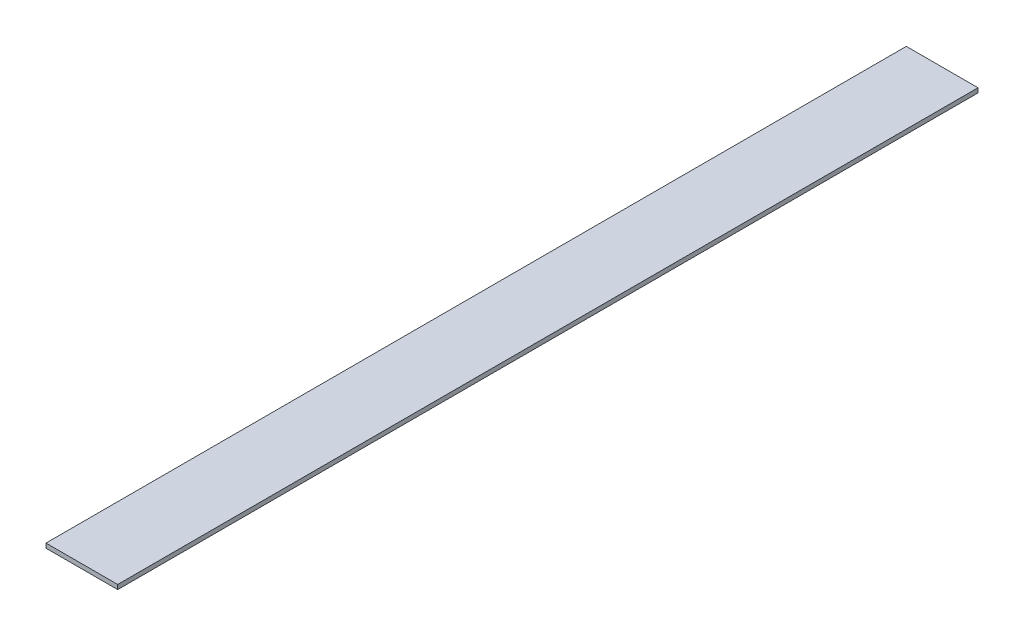
ISO-10303-21;
HEADER;
FILE_DESCRIPTION(('STEP AP214'),'2;1');
FILE_NAME('part.step','',(''),(''),'','','');
FILE_SCHEMA(('AUTOMOTIVE_DESIGN { 1 0 10303 214 1 1 1 1 }'));
ENDSEC;
DATA;
#1=APPLICATION_CONTEXT('core data for automotive mechanical design processes');
#2=APPLICATION_PROTOCOL_DEFINITION('international standard','automotive_design',2000,#1);
#3=PRODUCT_CONTEXT('',#1,'mechanical');
#4=PRODUCT('Part','Part','',(#3));
#5=PRODUCT_RELATED_PRODUCT_CATEGORY('part','',(#4));
#6=PRODUCT_DEFINITION_FORMATION('','',#4);
#7=PRODUCT_DEFINITION_CONTEXT('part definition',#1,'design');
#8=PRODUCT_DEFINITION('design','',#6,#7);
#9=PRODUCT_DEFINITION_SHAPE('','',#8);
#10=(LENGTH_UNIT() NAMED_UNIT(*) SI_UNIT(.MILLI.,.METRE.));
#11=(NAMED_UNIT(*) PLANE_ANGLE_UNIT() SI_UNIT($,.RADIAN.));
#12=(NAMED_UNIT(*) SI_UNIT($,.STERADIAN.) SOLID_ANGLE_UNIT());
#13=UNCERTAINTY_MEASURE_WITH_UNIT(LENGTH_MEASURE(1.E-05),#10,'distance_accuracy_value','');
#14=(GEOMETRIC_REPRESENTATION_CONTEXT(3) GLOBAL_UNCERTAINTY_ASSIGNED_CONTEXT((#13)) GLOBAL_UNIT_ASSIGNED_CONTEXT((#10,
#11,#12)) REPRESENTATION_CONTEXT('',''));
#15=CARTESIAN_POINT('',(0.,0.,0.));
#16=DIRECTION('',(0.,0.,1.));
#17=DIRECTION('',(1.,0.,0.));
#18=AXIS2_PLACEMENT_3D('',#15,#16,#17);
#19=CARTESIAN_POINT('',(12.7,1.5875,152.4));
#20=DIRECTION('',(-1.,0.,0.));
#21=DIRECTION('',(0.,0.,1.));
#22=AXIS2_PLACEMENT_3D('',#19,#20,#21);
#23=PLANE('',#22);
#24=DIRECTION('',(0.,0.,-1.));
#25=VECTOR('',#24,1.);
#26=CARTESIAN_POINT('',(12.7,0.,152.4));
#27=LINE('',#26,#25);
#28=CARTESIAN_POINT('',(12.7,0.,152.4));
#29=VERTEX_POINT('',#28);
#30=CARTESIAN_POINT('',(12.7,0.,-152.4));
#31=VERTEX_POINT('',#30);
#32=EDGE_CURVE('E107',#29,#31,#27,.T.);
#33=ORIENTED_EDGE('',*,*,#32,.T.);
#34=DIRECTION('',(0.,-1.,0.));
#35=VECTOR('',#34,1.);
#36=CARTESIAN_POINT('',(12.7,1.5875,-152.4));
#37=LINE('',#36,#35);
#38=CARTESIAN_POINT('',(12.7,1.5875,-152.4));
#39=VERTEX_POINT('',#38);
#40=EDGE_CURVE('E11',#39,#31,#37,.T.);
#41=ORIENTED_EDGE('',*,*,#40,.F.);
#42=DIRECTION('',(0.,0.,-1.));
#43=VECTOR('',#42,1.);
#44=CARTESIAN_POINT('',(12.7,1.5875,152.4));
#45=LINE('',#44,#43);
#46=CARTESIAN_POINT('',(12.7,1.5875,152.4));
#47=VERTEX_POINT('',#46);
#48=EDGE_CURVE('E91',#47,#39,#45,.T.);
#49=ORIENTED_EDGE('',*,*,#48,.F.);
#50=DIRECTION('',(0.,-1.,0.));
#51=VECTOR('',#50,1.);
#52=CARTESIAN_POINT('',(12.7,1.5875,152.4));
#53=LINE('',#52,#51);
#54=EDGE_CURVE('E103',#47,#29,#53,.T.);
#55=ORIENTED_EDGE('',*,*,#54,.T.);
#56=EDGE_LOOP('',(#33,#41,#49,#55));
#57=FACE_BOUND('',#56,.T.);
#58=ADVANCED_FACE('F39',(#57),#23,.F.);
#59=CARTESIAN_POINT('',(-12.7,1.5875,-152.4));
#60=DIRECTION('',(0.,0.,1.));
#61=DIRECTION('',(1.,0.,0.));
#62=AXIS2_PLACEMENT_3D('',#59,#60,#61);
#63=PLANE('',#62);
#64=DIRECTION('',(-1.,0.,0.));
#65=VECTOR('',#64,1.);
#66=CARTESIAN_POINT('',(-12.7,0.,-152.4));
#67=LINE('',#66,#65);
#68=CARTESIAN_POINT('',(-12.7,0.,-152.4));
#69=VERTEX_POINT('',#68);
#70=EDGE_CURVE('E96',#31,#69,#67,.T.);
#71=ORIENTED_EDGE('',*,*,#70,.T.);
#72=DIRECTION('',(0.,-1.,0.));
#73=VECTOR('',#72,1.);
#74=CARTESIAN_POINT('',(-12.7,1.5875,-152.4));
#75=LINE('',#74,#73);
#76=CARTESIAN_POINT('',(-12.7,1.5875,-152.4));
#77=VERTEX_POINT('',#76);
#78=EDGE_CURVE('E48',#77,#69,#75,.T.);
#79=ORIENTED_EDGE('',*,*,#78,.F.);
#80=DIRECTION('',(-1.,0.,0.));
#81=VECTOR('',#80,1.);
#82=CARTESIAN_POINT('',(-12.7,1.5875,-152.4));
#83=LINE('',#82,#81);
#84=EDGE_CURVE('E86',#39,#77,#83,.T.);
#85=ORIENTED_EDGE('',*,*,#84,.F.);
#86=ORIENTED_EDGE('',*,*,#40,.T.);
#87=EDGE_LOOP('',(#71,#79,#85,#86));
#88=FACE_BOUND('',#87,.T.);
#89=ADVANCED_FACE('F95',(#88),#63,.F.);
#90=CARTESIAN_POINT('',(-12.7,1.5875,152.4));
#91=DIRECTION('',(1.,0.,0.));
#92=DIRECTION('',(0.,0.,-1.));
#93=AXIS2_PLACEMENT_3D('',#90,#91,#92);
#94=PLANE('',#93);
#95=DIRECTION('',(0.,0.,1.));
#96=VECTOR('',#95,1.);
#97=CARTESIAN_POINT('',(-12.7,0.,152.4));
#98=LINE('',#97,#96);
#99=CARTESIAN_POINT('',(-12.7,0.,152.4));
#100=VERTEX_POINT('',#99);
#101=EDGE_CURVE('E73',#69,#100,#98,.T.);
#102=ORIENTED_EDGE('',*,*,#101,.T.);
#103=DIRECTION('',(0.,-1.,0.));
#104=VECTOR('',#103,1.);
#105=CARTESIAN_POINT('',(-12.7,1.5875,152.4));
#106=LINE('',#105,#104);
#107=CARTESIAN_POINT('',(-12.7,1.5875,152.4));
#108=VERTEX_POINT('',#107);
#109=EDGE_CURVE('E98',#108,#100,#106,.T.);
#110=ORIENTED_EDGE('',*,*,#109,.F.);
#111=DIRECTION('',(0.,0.,1.));
#112=VECTOR('',#111,1.);
#113=CARTESIAN_POINT('',(-12.7,1.5875,152.4));
#114=LINE('',#113,#112);
#115=EDGE_CURVE('E89',#77,#108,#114,.T.);
#116=ORIENTED_EDGE('',*,*,#115,.F.);
#117=ORIENTED_EDGE('',*,*,#78,.T.);
#118=EDGE_LOOP('',(#102,#110,#116,#117));
#119=FACE_BOUND('',#118,.T.);
#120=ADVANCED_FACE('F99',(#119),#94,.F.);
#121=CARTESIAN_POINT('',(-12.7,1.5875,152.4));
#122=DIRECTION('',(0.,0.,-1.));
#123=DIRECTION('',(-1.,0.,0.));
#124=AXIS2_PLACEMENT_3D('',#121,#122,#123);
#125=PLANE('',#124);
#126=DIRECTION('',(1.,0.,0.));
#127=VECTOR('',#126,1.);
#128=CARTESIAN_POINT('',(-12.7,0.,152.4));
#129=LINE('',#128,#127);
#130=EDGE_CURVE('E79',#100,#29,#129,.T.);
#131=ORIENTED_EDGE('',*,*,#130,.T.);
#132=ORIENTED_EDGE('',*,*,#54,.F.);
#133=DIRECTION('',(1.,0.,0.));
#134=VECTOR('',#133,1.);
#135=CARTESIAN_POINT('',(-12.7,1.5875,152.4));
#136=LINE('',#135,#134);
#137=EDGE_CURVE('E56',#108,#47,#136,.T.);
#138=ORIENTED_EDGE('',*,*,#137,.F.);
#139=ORIENTED_EDGE('',*,*,#109,.T.);
#140=EDGE_LOOP('',(#131,#132,#138,#139));
#141=FACE_BOUND('',#140,.T.);
#142=ADVANCED_FACE('F120',(#141),#125,.F.);
#143=CARTESIAN_POINT('',(0.,1.5875,0.));
#144=DIRECTION('',(0.,-1.,0.));
#145=DIRECTION('',(0.,0.,-1.));
#146=AXIS2_PLACEMENT_3D('',#143,#144,#145);
#147=PLANE('',#146);
#148=ORIENTED_EDGE('',*,*,#48,.T.);
#149=ORIENTED_EDGE('',*,*,#84,.T.);
#150=ORIENTED_EDGE('',*,*,#115,.T.);
#151=ORIENTED_EDGE('',*,*,#137,.T.);
#152=EDGE_LOOP('',(#148,#149,#150,#151));
#153=FACE_BOUND('',#152,.T.);
#154=ADVANCED_FACE('F87',(#153),#147,.F.);
#155=CARTESIAN_POINT('',(0.,0.,0.));
#156=DIRECTION('',(0.,-1.,0.));
#157=DIRECTION('',(0.,0.,-1.));
#158=AXIS2_PLACEMENT_3D('',#155,#156,#157);
#159=PLANE('',#158);
#160=ORIENTED_EDGE('',*,*,#32,.F.);
#161=ORIENTED_EDGE('',*,*,#130,.F.);
#162=ORIENTED_EDGE('',*,*,#101,.F.);
#163=ORIENTED_EDGE('',*,*,#70,.F.);
#164=EDGE_LOOP('',(#160,#161,#162,#163));
#165=FACE_BOUND('',#164,.T.);
#166=ADVANCED_FACE('F123',(#165),#159,.T.);
#167=CLOSED_SHELL('',(#58,#89,#120,#142,#154,#166));
#168=MANIFOLD_SOLID_BREP('B2',#167);
#169=ADVANCED_BREP_SHAPE_REPRESENTATION('',(#18,#168),#14);
#170=SHAPE_DEFINITION_REPRESENTATION(#9,#169);
ENDSEC;
END-ISO-10303-21;
